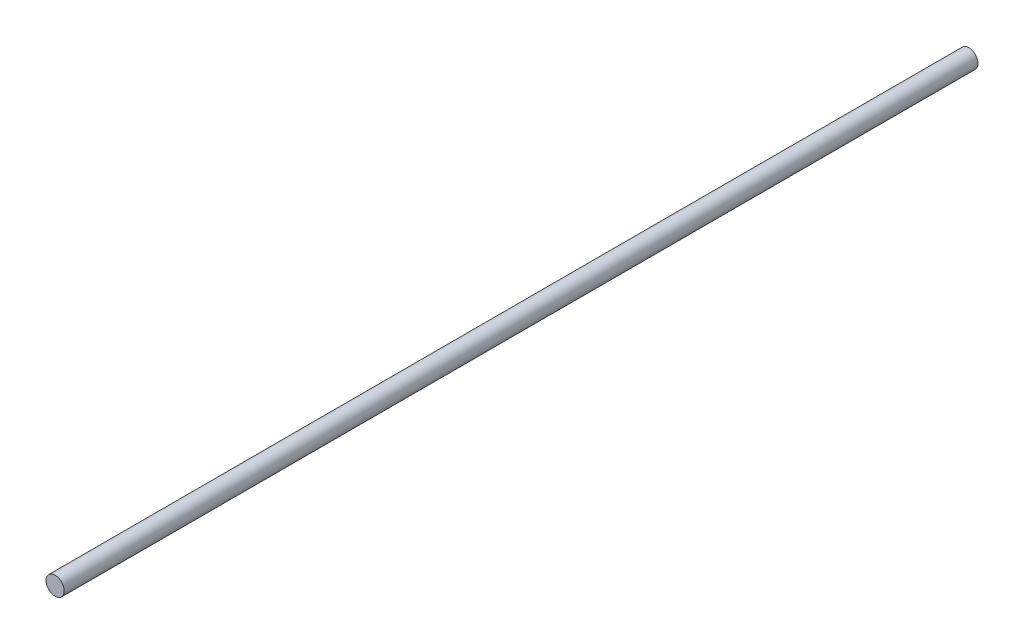
ISO-10303-21;
HEADER;
FILE_DESCRIPTION(('STEP AP214'),'2;1');
FILE_NAME('part.step','',(''),(''),'','','');
FILE_SCHEMA(('AUTOMOTIVE_DESIGN { 1 0 10303 214 1 1 1 1 }'));
ENDSEC;
DATA;
#1=APPLICATION_CONTEXT('core data for automotive mechanical design processes');
#2=APPLICATION_PROTOCOL_DEFINITION('international standard','automotive_design',2000,#1);
#3=PRODUCT_CONTEXT('',#1,'mechanical');
#4=PRODUCT('Part','Part','',(#3));
#5=PRODUCT_RELATED_PRODUCT_CATEGORY('part','',(#4));
#6=PRODUCT_DEFINITION_FORMATION('','',#4);
#7=PRODUCT_DEFINITION_CONTEXT('part definition',#1,'design');
#8=PRODUCT_DEFINITION('design','',#6,#7);
#9=PRODUCT_DEFINITION_SHAPE('','',#8);
#10=(LENGTH_UNIT() NAMED_UNIT(*) SI_UNIT(.MILLI.,.METRE.));
#11=(NAMED_UNIT(*) PLANE_ANGLE_UNIT() SI_UNIT($,.RADIAN.));
#12=(NAMED_UNIT(*) SI_UNIT($,.STERADIAN.) SOLID_ANGLE_UNIT());
#13=UNCERTAINTY_MEASURE_WITH_UNIT(LENGTH_MEASURE(1.E-05),#10,'distance_accuracy_value','');
#14=(GEOMETRIC_REPRESENTATION_CONTEXT(3) GLOBAL_UNCERTAINTY_ASSIGNED_CONTEXT((#13)) GLOBAL_UNIT_ASSIGNED_CONTEXT((#10,
#11,#12)) REPRESENTATION_CONTEXT('',''));
#15=CARTESIAN_POINT('',(0.,0.,0.));
#16=DIRECTION('',(0.,0.,1.));
#17=DIRECTION('',(1.,0.,0.));
#18=AXIS2_PLACEMENT_3D('',#15,#16,#17);
#19=CARTESIAN_POINT('',(0.,0.,1500.));
#20=DIRECTION('',(0.,0.,-1.));
#21=DIRECTION('',(-1.,0.,0.));
#22=AXIS2_PLACEMENT_3D('',#19,#20,#21);
#23=CYLINDRICAL_SURFACE('',#22,15.);
#24=CARTESIAN_POINT('',(0.,0.,1500.));
#25=DIRECTION('',(0.,0.,1.));
#26=DIRECTION('',(1.,0.,0.));
#27=AXIS2_PLACEMENT_3D('',#24,#25,#26);
#28=CIRCLE('',#27,15.);
#29=CARTESIAN_POINT('',(15.,0.,1500.));
#30=VERTEX_POINT('',#29);
#31=EDGE_CURVE('E10',#30,#30,#28,.T.);
#32=ORIENTED_EDGE('',*,*,#31,.F.);
#33=EDGE_LOOP('',(#32));
#34=FACE_BOUND('',#33,.T.);
#35=CARTESIAN_POINT('',(0.,0.,0.));
#36=DIRECTION('',(0.,0.,1.));
#37=DIRECTION('',(1.,0.,0.));
#38=AXIS2_PLACEMENT_3D('',#35,#36,#37);
#39=CIRCLE('',#38,15.);
#40=CARTESIAN_POINT('',(15.,0.,0.));
#41=VERTEX_POINT('',#40);
#42=EDGE_CURVE('E33',#41,#41,#39,.T.);
#43=ORIENTED_EDGE('',*,*,#42,.T.);
#44=EDGE_LOOP('',(#43));
#45=FACE_BOUND('',#44,.T.);
#46=ADVANCED_FACE('F30',(#34,#45),#23,.T.);
#47=CARTESIAN_POINT('',(0.,0.,1500.));
#48=DIRECTION('',(0.,0.,1.));
#49=DIRECTION('',(1.,0.,0.));
#50=AXIS2_PLACEMENT_3D('',#47,#48,#49);
#51=PLANE('',#50);
#52=ORIENTED_EDGE('',*,*,#31,.T.);
#53=EDGE_LOOP('',(#52));
#54=FACE_BOUND('',#53,.T.);
#55=ADVANCED_FACE('F45',(#54),#51,.T.);
#56=CARTESIAN_POINT('',(0.,0.,0.));
#57=DIRECTION('',(0.,0.,1.));
#58=DIRECTION('',(1.,0.,0.));
#59=AXIS2_PLACEMENT_3D('',#56,#57,#58);
#60=PLANE('',#59);
#61=ORIENTED_EDGE('',*,*,#42,.F.);
#62=EDGE_LOOP('',(#61));
#63=FACE_BOUND('',#62,.T.);
#64=ADVANCED_FACE('F43',(#63),#60,.F.);
#65=CLOSED_SHELL('',(#46,#55,#64));
#66=MANIFOLD_SOLID_BREP('B2',#65);
#67=ADVANCED_BREP_SHAPE_REPRESENTATION('',(#18,#66),#14);
#68=SHAPE_DEFINITION_REPRESENTATION(#9,#67);
ENDSEC;
END-ISO-10303-21;
